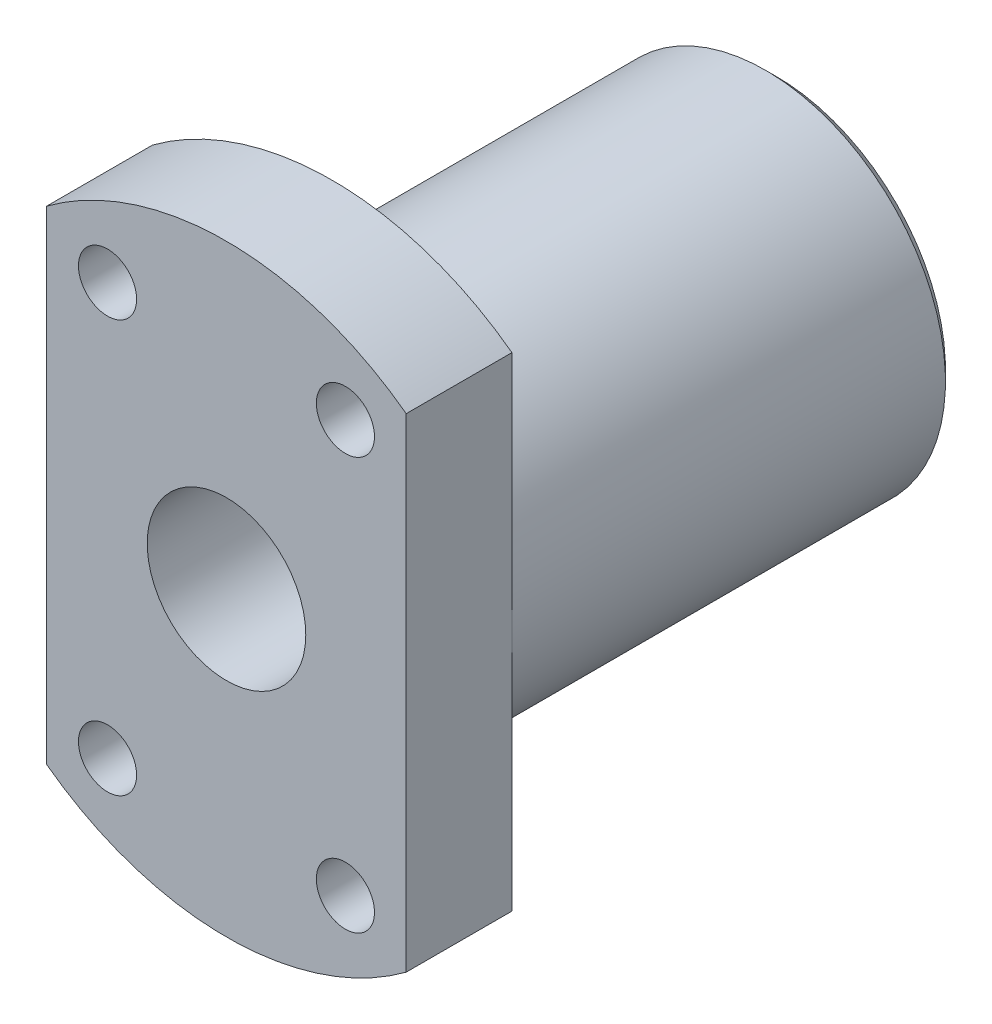
ISO-10303-21;
HEADER;
FILE_DESCRIPTION(('STEP AP214'),'2;1');
FILE_NAME('part.step','',(''),(''),'','','');
FILE_SCHEMA(('AUTOMOTIVE_DESIGN { 1 0 10303 214 1 1 1 1 }'));
ENDSEC;
DATA;
#1=APPLICATION_CONTEXT('core data for automotive mechanical design processes');
#2=APPLICATION_PROTOCOL_DEFINITION('international standard','automotive_design',2000,#1);
#3=PRODUCT_CONTEXT('',#1,'mechanical');
#4=PRODUCT('Part','Part','',(#3));
#5=PRODUCT_RELATED_PRODUCT_CATEGORY('part','',(#4));
#6=PRODUCT_DEFINITION_FORMATION('','',#4);
#7=PRODUCT_DEFINITION_CONTEXT('part definition',#1,'design');
#8=PRODUCT_DEFINITION('design','',#6,#7);
#9=PRODUCT_DEFINITION_SHAPE('','',#8);
#10=(LENGTH_UNIT() NAMED_UNIT(*) SI_UNIT(.MILLI.,.METRE.));
#11=(NAMED_UNIT(*) PLANE_ANGLE_UNIT() SI_UNIT($,.RADIAN.));
#12=(NAMED_UNIT(*) SI_UNIT($,.STERADIAN.) SOLID_ANGLE_UNIT());
#13=UNCERTAINTY_MEASURE_WITH_UNIT(LENGTH_MEASURE(1.E-05),#10,'distance_accuracy_value','');
#14=(GEOMETRIC_REPRESENTATION_CONTEXT(3) GLOBAL_UNCERTAINTY_ASSIGNED_CONTEXT((#13)) GLOBAL_UNIT_ASSIGNED_CONTEXT((#10,
#11,#12)) REPRESENTATION_CONTEXT('',''));
#15=CARTESIAN_POINT('',(0.,0.,0.));
#16=DIRECTION('',(0.,0.,1.));
#17=DIRECTION('',(1.,0.,0.));
#18=AXIS2_PLACEMENT_3D('',#15,#16,#17);
#19=CARTESIAN_POINT('',(0.,0.,0.));
#20=DIRECTION('',(0.,0.,1.));
#21=DIRECTION('',(1.,0.,0.));
#22=AXIS2_PLACEMENT_3D('',#19,#20,#21);
#23=PLANE('',#22);
#24=CARTESIAN_POINT('',(-11.25,19.4855715851499,0.));
#25=DIRECTION('',(0.,0.,-1.));
#26=DIRECTION('',(1.,0.,0.));
#27=AXIS2_PLACEMENT_3D('',#24,#25,#26);
#28=CIRCLE('',#27,2.75);
#29=CARTESIAN_POINT('',(-14.,19.4855715851499,0.));
#30=VERTEX_POINT('',#29);
#31=EDGE_CURVE('E132',#30,#30,#28,.T.);
#32=ORIENTED_EDGE('',*,*,#31,.F.);
#33=EDGE_LOOP('',(#32));
#34=FACE_BOUND('',#33,.T.);
#35=CARTESIAN_POINT('',(11.25,19.4855715851499,0.));
#36=DIRECTION('',(0.,0.,-1.));
#37=DIRECTION('',(-1.,0.,0.));
#38=AXIS2_PLACEMENT_3D('',#35,#36,#37);
#39=CIRCLE('',#38,2.75);
#40=CARTESIAN_POINT('',(8.50000000000003,19.4855715851499,0.));
#41=VERTEX_POINT('',#40);
#42=EDGE_CURVE('E108',#41,#41,#39,.T.);
#43=ORIENTED_EDGE('',*,*,#42,.F.);
#44=EDGE_LOOP('',(#43));
#45=FACE_BOUND('',#44,.T.);
#46=CARTESIAN_POINT('',(0.,0.,0.));
#47=DIRECTION('',(0.,0.,-1.));
#48=DIRECTION('',(-1.,0.,0.));
#49=AXIS2_PLACEMENT_3D('',#46,#47,#48);
#50=CIRCLE('',#49,17.);
#51=CARTESIAN_POINT('',(-17.,0.,0.));
#52=VERTEX_POINT('',#51);
#53=CARTESIAN_POINT('',(17.,0.,0.));
#54=VERTEX_POINT('',#53);
#55=EDGE_CURVE('E97',#52,#54,#50,.T.);
#56=ORIENTED_EDGE('',*,*,#55,.F.);
#57=DIRECTION('',(0.,1.,0.));
#58=VECTOR('',#57,1.);
#59=CARTESIAN_POINT('',(-17.,0.,0.));
#60=LINE('',#59,#58);
#61=CARTESIAN_POINT('',(-17.,22.8746584673957,0.));
#62=VERTEX_POINT('',#61);
#63=EDGE_CURVE('E83',#52,#62,#60,.T.);
#64=ORIENTED_EDGE('',*,*,#63,.T.);
#65=CARTESIAN_POINT('',(0.,0.,0.));
#66=DIRECTION('',(0.,0.,1.));
#67=DIRECTION('',(1.,0.,0.));
#68=AXIS2_PLACEMENT_3D('',#65,#66,#67);
#69=CIRCLE('',#68,28.5);
#70=CARTESIAN_POINT('',(17.,22.8746584673957,0.));
#71=VERTEX_POINT('',#70);
#72=EDGE_CURVE('E122',#71,#62,#69,.T.);
#73=ORIENTED_EDGE('',*,*,#72,.F.);
#74=DIRECTION('',(0.,-1.,0.));
#75=VECTOR('',#74,1.);
#76=CARTESIAN_POINT('',(17.,0.,0.));
#77=LINE('',#76,#75);
#78=EDGE_CURVE('E98',#71,#54,#77,.T.);
#79=ORIENTED_EDGE('',*,*,#78,.T.);
#80=EDGE_LOOP('',(#56,#64,#73,#79));
#81=FACE_BOUND('',#80,.T.);
#82=ADVANCED_FACE('F33',(#34,#45,#81),#23,.F.);
#83=CARTESIAN_POINT('',(11.25,-19.4855715851499,0.));
#84=DIRECTION('',(0.,0.,-1.));
#85=DIRECTION('',(1.,0.,0.));
#86=AXIS2_PLACEMENT_3D('',#83,#84,#85);
#87=CIRCLE('',#86,2.75);
#88=CARTESIAN_POINT('',(8.50000000000002,-19.4855715851499,0.));
#89=VERTEX_POINT('',#88);
#90=EDGE_CURVE('E139',#89,#89,#87,.T.);
#91=ORIENTED_EDGE('',*,*,#90,.F.);
#92=EDGE_LOOP('',(#91));
#93=FACE_BOUND('',#92,.T.);
#94=CARTESIAN_POINT('',(-11.25,-19.4855715851499,0.));
#95=DIRECTION('',(0.,0.,-1.));
#96=DIRECTION('',(-1.,0.,0.));
#97=AXIS2_PLACEMENT_3D('',#94,#95,#96);
#98=CIRCLE('',#97,2.75);
#99=CARTESIAN_POINT('',(-14.,-19.4855715851499,0.));
#100=VERTEX_POINT('',#99);
#101=EDGE_CURVE('E136',#100,#100,#98,.T.);
#102=ORIENTED_EDGE('',*,*,#101,.F.);
#103=EDGE_LOOP('',(#102));
#104=FACE_BOUND('',#103,.T.);
#105=EDGE_CURVE('E48',#54,#52,#50,.T.);
#106=ORIENTED_EDGE('',*,*,#105,.F.);
#107=CARTESIAN_POINT('',(17.,-22.8746584673958,0.));
#108=VERTEX_POINT('',#107);
#109=EDGE_CURVE('E52',#54,#108,#77,.T.);
#110=ORIENTED_EDGE('',*,*,#109,.T.);
#111=CARTESIAN_POINT('',(-17.,-22.8746584673958,0.));
#112=VERTEX_POINT('',#111);
#113=EDGE_CURVE('E80',#112,#108,#69,.T.);
#114=ORIENTED_EDGE('',*,*,#113,.F.);
#115=EDGE_CURVE('E76',#112,#52,#60,.T.);
#116=ORIENTED_EDGE('',*,*,#115,.T.);
#117=EDGE_LOOP('',(#106,#110,#114,#116));
#118=FACE_BOUND('',#117,.T.);
#119=ADVANCED_FACE('F78',(#93,#104,#118),#23,.F.);
#120=CARTESIAN_POINT('',(0.,0.,10.));
#121=DIRECTION('',(0.,0.,-1.));
#122=DIRECTION('',(-1.,0.,0.));
#123=AXIS2_PLACEMENT_3D('',#120,#121,#122);
#124=CYLINDRICAL_SURFACE('',#123,28.5);
#125=CARTESIAN_POINT('',(0.,0.,10.));
#126=DIRECTION('',(0.,0.,1.));
#127=DIRECTION('',(1.,0.,0.));
#128=AXIS2_PLACEMENT_3D('',#125,#126,#127);
#129=CIRCLE('',#128,28.5);
#130=CARTESIAN_POINT('',(17.,22.8746584673957,10.));
#131=VERTEX_POINT('',#130);
#132=CARTESIAN_POINT('',(-17.,22.8746584673957,10.));
#133=VERTEX_POINT('',#132);
#134=EDGE_CURVE('E125',#131,#133,#129,.T.);
#135=ORIENTED_EDGE('',*,*,#134,.F.);
#136=DIRECTION('',(0.,0.,-1.));
#137=VECTOR('',#136,1.);
#138=CARTESIAN_POINT('',(17.,22.8746584673957,10.));
#139=LINE('',#138,#137);
#140=EDGE_CURVE('E114',#131,#71,#139,.T.);
#141=ORIENTED_EDGE('',*,*,#140,.T.);
#142=ORIENTED_EDGE('',*,*,#72,.T.);
#143=DIRECTION('',(0.,0.,-1.));
#144=VECTOR('',#143,1.);
#145=CARTESIAN_POINT('',(-17.,22.8746584673957,10.));
#146=LINE('',#145,#144);
#147=EDGE_CURVE('E90',#62,#133,#146,.F.);
#148=ORIENTED_EDGE('',*,*,#147,.T.);
#149=EDGE_LOOP('',(#135,#141,#142,#148));
#150=FACE_BOUND('',#149,.T.);
#151=ADVANCED_FACE('F194',(#150),#124,.T.);
#152=ORIENTED_EDGE('',*,*,#113,.T.);
#153=DIRECTION('',(0.,0.,-1.));
#154=VECTOR('',#153,1.);
#155=CARTESIAN_POINT('',(17.,-22.8746584673958,10.));
#156=LINE('',#155,#154);
#157=CARTESIAN_POINT('',(17.,-22.8746584673958,10.));
#158=VERTEX_POINT('',#157);
#159=EDGE_CURVE('E111',#108,#158,#156,.F.);
#160=ORIENTED_EDGE('',*,*,#159,.T.);
#161=CARTESIAN_POINT('',(-17.,-22.8746584673958,10.));
#162=VERTEX_POINT('',#161);
#163=EDGE_CURVE('E94',#162,#158,#129,.T.);
#164=ORIENTED_EDGE('',*,*,#163,.F.);
#165=DIRECTION('',(0.,0.,-1.));
#166=VECTOR('',#165,1.);
#167=CARTESIAN_POINT('',(-17.,-22.8746584673958,10.));
#168=LINE('',#167,#166);
#169=EDGE_CURVE('E120',#162,#112,#168,.T.);
#170=ORIENTED_EDGE('',*,*,#169,.T.);
#171=EDGE_LOOP('',(#152,#160,#164,#170));
#172=FACE_BOUND('',#171,.T.);
#173=ADVANCED_FACE('F191',(#172),#124,.T.);
#174=CARTESIAN_POINT('',(0.,0.,10.));
#175=DIRECTION('',(0.,0.,1.));
#176=DIRECTION('',(1.,0.,0.));
#177=AXIS2_PLACEMENT_3D('',#174,#175,#176);
#178=PLANE('',#177);
#179=CARTESIAN_POINT('',(0.,0.,10.));
#180=DIRECTION('',(0.,0.,1.));
#181=DIRECTION('',(1.,0.,0.));
#182=AXIS2_PLACEMENT_3D('',#179,#180,#181);
#183=CIRCLE('',#182,7.5);
#184=CARTESIAN_POINT('',(7.5,0.,10.));
#185=VERTEX_POINT('',#184);
#186=EDGE_CURVE('E150',#185,#185,#183,.T.);
#187=ORIENTED_EDGE('',*,*,#186,.F.);
#188=EDGE_LOOP('',(#187));
#189=FACE_BOUND('',#188,.T.);
#190=CARTESIAN_POINT('',(11.25,-19.4855715851499,10.));
#191=DIRECTION('',(0.,0.,1.));
#192=DIRECTION('',(1.,0.,0.));
#193=AXIS2_PLACEMENT_3D('',#190,#191,#192);
#194=CIRCLE('',#193,2.75);
#195=CARTESIAN_POINT('',(8.50000000000002,-19.4855715851499,9.99999999999999));
#196=VERTEX_POINT('',#195);
#197=EDGE_CURVE('E137',#196,#196,#194,.T.);
#198=ORIENTED_EDGE('',*,*,#197,.F.);
#199=EDGE_LOOP('',(#198));
#200=FACE_BOUND('',#199,.T.);
#201=CARTESIAN_POINT('',(-11.25,-19.4855715851499,10.));
#202=DIRECTION('',(0.,0.,1.));
#203=DIRECTION('',(1.,0.,0.));
#204=AXIS2_PLACEMENT_3D('',#201,#202,#203);
#205=CIRCLE('',#204,2.75);
#206=CARTESIAN_POINT('',(-14.,-19.4855715851499,9.99999999999999));
#207=VERTEX_POINT('',#206);
#208=EDGE_CURVE('E133',#207,#207,#205,.T.);
#209=ORIENTED_EDGE('',*,*,#208,.F.);
#210=EDGE_LOOP('',(#209));
#211=FACE_BOUND('',#210,.T.);
#212=CARTESIAN_POINT('',(-11.25,19.4855715851499,10.));
#213=DIRECTION('',(0.,0.,1.));
#214=DIRECTION('',(1.,0.,0.));
#215=AXIS2_PLACEMENT_3D('',#212,#213,#214);
#216=CIRCLE('',#215,2.75);
#217=CARTESIAN_POINT('',(-14.,19.4855715851499,9.99999999999999));
#218=VERTEX_POINT('',#217);
#219=EDGE_CURVE('E129',#218,#218,#216,.T.);
#220=ORIENTED_EDGE('',*,*,#219,.F.);
#221=EDGE_LOOP('',(#220));
#222=FACE_BOUND('',#221,.T.);
#223=CARTESIAN_POINT('',(11.25,19.4855715851499,10.));
#224=DIRECTION('',(0.,0.,1.));
#225=DIRECTION('',(1.,0.,0.));
#226=AXIS2_PLACEMENT_3D('',#223,#224,#225);
#227=CIRCLE('',#226,2.75);
#228=CARTESIAN_POINT('',(8.50000000000003,19.4855715851499,9.99999999999999));
#229=VERTEX_POINT('',#228);
#230=EDGE_CURVE('E101',#229,#229,#227,.T.);
#231=ORIENTED_EDGE('',*,*,#230,.F.);
#232=EDGE_LOOP('',(#231));
#233=FACE_BOUND('',#232,.T.);
#234=DIRECTION('',(0.,-1.,0.));
#235=VECTOR('',#234,1.);
#236=CARTESIAN_POINT('',(17.,37.2733529755393,10.));
#237=LINE('',#236,#235);
#238=EDGE_CURVE('E100',#131,#158,#237,.T.);
#239=ORIENTED_EDGE('',*,*,#238,.F.);
#240=ORIENTED_EDGE('',*,*,#134,.T.);
#241=DIRECTION('',(0.,1.,0.));
#242=VECTOR('',#241,1.);
#243=CARTESIAN_POINT('',(-17.,37.2733529755393,10.));
#244=LINE('',#243,#242);
#245=EDGE_CURVE('E117',#162,#133,#244,.T.);
#246=ORIENTED_EDGE('',*,*,#245,.F.);
#247=ORIENTED_EDGE('',*,*,#163,.T.);
#248=EDGE_LOOP('',(#239,#240,#246,#247));
#249=FACE_BOUND('',#248,.T.);
#250=ADVANCED_FACE('F189',(#189,#200,#211,#222,#233,#249),#178,.T.);
#251=CARTESIAN_POINT('',(-17.,37.2733529755393,0.));
#252=DIRECTION('',(1.,0.,0.));
#253=DIRECTION('',(0.,1.,0.));
#254=AXIS2_PLACEMENT_3D('',#251,#252,#253);
#255=PLANE('',#254);
#256=ORIENTED_EDGE('',*,*,#245,.T.);
#257=ORIENTED_EDGE('',*,*,#147,.F.);
#258=ORIENTED_EDGE('',*,*,#63,.F.);
#259=ORIENTED_EDGE('',*,*,#115,.F.);
#260=ORIENTED_EDGE('',*,*,#169,.F.);
#261=EDGE_LOOP('',(#256,#257,#258,#259,#260));
#262=FACE_BOUND('',#261,.T.);
#263=ADVANCED_FACE('F88',(#262),#255,.F.);
#264=CARTESIAN_POINT('',(17.,37.2733529755393,0.));
#265=DIRECTION('',(-1.,0.,0.));
#266=DIRECTION('',(0.,-1.,0.));
#267=AXIS2_PLACEMENT_3D('',#264,#265,#266);
#268=PLANE('',#267);
#269=ORIENTED_EDGE('',*,*,#238,.T.);
#270=ORIENTED_EDGE('',*,*,#159,.F.);
#271=ORIENTED_EDGE('',*,*,#109,.F.);
#272=ORIENTED_EDGE('',*,*,#78,.F.);
#273=ORIENTED_EDGE('',*,*,#140,.F.);
#274=EDGE_LOOP('',(#269,#270,#271,#272,#273));
#275=FACE_BOUND('',#274,.T.);
#276=ADVANCED_FACE('F182',(#275),#268,.F.);
#277=CARTESIAN_POINT('',(0.,0.,-42.));
#278=DIRECTION('',(0.,0.,1.));
#279=DIRECTION('',(1.,0.,0.));
#280=AXIS2_PLACEMENT_3D('',#277,#278,#279);
#281=CYLINDRICAL_SURFACE('',#280,17.);
#282=CARTESIAN_POINT('',(0.,0.,-41.));
#283=DIRECTION('',(0.,0.,-1.));
#284=DIRECTION('',(-1.,0.,0.));
#285=AXIS2_PLACEMENT_3D('',#282,#283,#284);
#286=CIRCLE('',#285,17.);
#287=CARTESIAN_POINT('',(-17.,0.,-41.));
#288=VERTEX_POINT('',#287);
#289=EDGE_CURVE('E11',#288,#288,#286,.F.);
#290=ORIENTED_EDGE('',*,*,#289,.T.);
#291=EDGE_LOOP('',(#290));
#292=FACE_BOUND('',#291,.T.);
#293=ORIENTED_EDGE('',*,*,#55,.T.);
#294=ORIENTED_EDGE('',*,*,#105,.T.);
#295=EDGE_LOOP('',(#293,#294));
#296=FACE_BOUND('',#295,.T.);
#297=ADVANCED_FACE('F103',(#292,#296),#281,.T.);
#298=CARTESIAN_POINT('',(0.,0.,-42.));
#299=DIRECTION('',(0.,0.,-1.));
#300=DIRECTION('',(-1.,0.,0.));
#301=AXIS2_PLACEMENT_3D('',#298,#299,#300);
#302=PLANE('',#301);
#303=CARTESIAN_POINT('',(0.,0.,-42.));
#304=DIRECTION('',(0.,0.,-1.));
#305=DIRECTION('',(-1.,0.,0.));
#306=AXIS2_PLACEMENT_3D('',#303,#304,#305);
#307=CIRCLE('',#306,16.);
#308=CARTESIAN_POINT('',(-16.,0.,-42.));
#309=VERTEX_POINT('',#308);
#310=EDGE_CURVE('E41',#309,#309,#307,.T.);
#311=ORIENTED_EDGE('',*,*,#310,.T.);
#312=EDGE_LOOP('',(#311));
#313=FACE_BOUND('',#312,.T.);
#314=CARTESIAN_POINT('',(0.,0.,-42.));
#315=DIRECTION('',(0.,0.,1.));
#316=DIRECTION('',(1.,0.,0.));
#317=AXIS2_PLACEMENT_3D('',#314,#315,#316);
#318=CIRCLE('',#317,7.5);
#319=CARTESIAN_POINT('',(7.5,0.,-42.));
#320=VERTEX_POINT('',#319);
#321=EDGE_CURVE('E145',#320,#320,#318,.T.);
#322=ORIENTED_EDGE('',*,*,#321,.T.);
#323=EDGE_LOOP('',(#322));
#324=FACE_BOUND('',#323,.T.);
#325=ADVANCED_FACE('F166',(#313,#324),#302,.T.);
#326=CARTESIAN_POINT('',(11.25,19.4855715851499,42.));
#327=DIRECTION('',(0.,0.,-1.));
#328=DIRECTION('',(-1.,0.,0.));
#329=AXIS2_PLACEMENT_3D('',#326,#327,#328);
#330=CYLINDRICAL_SURFACE('',#329,2.75);
#331=CARTESIAN_POINT('',(8.50000000000003,19.4855715851499,9.99999999999999));
#332=CARTESIAN_POINT('',(8.50000000000003,19.4855715851499,9.89583333333333));
#333=CARTESIAN_POINT('',(8.50000000000003,19.4855715851499,9.79166666666666));
#334=CARTESIAN_POINT('',(8.50000000000003,19.4855715851499,9.58333333333333));
#335=CARTESIAN_POINT('',(8.50000000000003,19.4855715851499,9.47916666666666));
#336=CARTESIAN_POINT('',(8.50000000000003,19.4855715851499,9.27083333333333));
#337=CARTESIAN_POINT('',(8.50000000000003,19.4855715851499,9.16666666666666));
#338=CARTESIAN_POINT('',(8.50000000000003,19.4855715851499,8.95833333333333));
#339=CARTESIAN_POINT('',(8.50000000000003,19.4855715851499,8.85416666666666));
#340=CARTESIAN_POINT('',(8.50000000000003,19.4855715851499,8.64583333333333));
#341=CARTESIAN_POINT('',(8.50000000000003,19.4855715851499,8.54166666666666));
#342=CARTESIAN_POINT('',(8.50000000000003,19.4855715851499,8.33333333333333));
#343=CARTESIAN_POINT('',(8.50000000000003,19.4855715851499,8.22916666666666));
#344=CARTESIAN_POINT('',(8.50000000000003,19.4855715851499,8.02083333333333));
#345=CARTESIAN_POINT('',(8.50000000000003,19.4855715851499,7.91666666666666));
#346=CARTESIAN_POINT('',(8.50000000000003,19.4855715851499,7.70833333333333));
#347=CARTESIAN_POINT('',(8.50000000000003,19.4855715851499,7.60416666666666));
#348=CARTESIAN_POINT('',(8.50000000000003,19.4855715851499,7.39583333333333));
#349=CARTESIAN_POINT('',(8.50000000000003,19.4855715851499,7.29166666666666));
#350=CARTESIAN_POINT('',(8.50000000000003,19.4855715851499,7.08333333333333));
#351=CARTESIAN_POINT('',(8.50000000000003,19.4855715851499,6.97916666666667));
#352=CARTESIAN_POINT('',(8.50000000000003,19.4855715851499,6.77083333333333));
#353=CARTESIAN_POINT('',(8.50000000000003,19.4855715851499,6.66666666666667));
#354=CARTESIAN_POINT('',(8.50000000000003,19.4855715851499,6.45833333333333));
#355=CARTESIAN_POINT('',(8.50000000000003,19.4855715851499,6.35416666666667));
#356=CARTESIAN_POINT('',(8.50000000000003,19.4855715851499,6.14583333333333));
#357=CARTESIAN_POINT('',(8.50000000000003,19.4855715851499,6.04166666666667));
#358=CARTESIAN_POINT('',(8.50000000000003,19.4855715851499,5.83333333333333));
#359=CARTESIAN_POINT('',(8.50000000000003,19.4855715851499,5.72916666666666));
#360=CARTESIAN_POINT('',(8.50000000000003,19.4855715851499,5.52083333333333));
#361=CARTESIAN_POINT('',(8.50000000000003,19.4855715851499,5.41666666666666));
#362=CARTESIAN_POINT('',(8.50000000000003,19.4855715851499,5.20833333333333));
#363=CARTESIAN_POINT('',(8.50000000000003,19.4855715851499,5.10416666666666));
#364=CARTESIAN_POINT('',(8.50000000000003,19.4855715851499,4.89583333333333));
#365=CARTESIAN_POINT('',(8.50000000000003,19.4855715851499,4.79166666666666));
#366=CARTESIAN_POINT('',(8.50000000000003,19.4855715851499,4.58333333333333));
#367=CARTESIAN_POINT('',(8.50000000000003,19.4855715851499,4.47916666666666));
#368=CARTESIAN_POINT('',(8.50000000000003,19.4855715851499,4.27083333333333));
#369=CARTESIAN_POINT('',(8.50000000000003,19.4855715851499,4.16666666666666));
#370=CARTESIAN_POINT('',(8.50000000000003,19.4855715851499,3.95833333333333));
#371=CARTESIAN_POINT('',(8.50000000000003,19.4855715851499,3.85416666666666));
#372=CARTESIAN_POINT('',(8.50000000000003,19.4855715851499,3.64583333333333));
#373=CARTESIAN_POINT('',(8.50000000000003,19.4855715851499,3.54166666666666));
#374=CARTESIAN_POINT('',(8.50000000000003,19.4855715851499,3.33333333333333));
#375=CARTESIAN_POINT('',(8.50000000000003,19.4855715851499,3.22916666666666));
#376=CARTESIAN_POINT('',(8.50000000000003,19.4855715851499,3.02083333333333));
#377=CARTESIAN_POINT('',(8.50000000000003,19.4855715851499,2.91666666666666));
#378=CARTESIAN_POINT('',(8.50000000000003,19.4855715851499,2.70833333333333));
#379=CARTESIAN_POINT('',(8.50000000000003,19.4855715851499,2.60416666666667));
#380=CARTESIAN_POINT('',(8.50000000000003,19.4855715851499,2.39583333333333));
#381=CARTESIAN_POINT('',(8.50000000000003,19.4855715851499,2.29166666666666));
#382=CARTESIAN_POINT('',(8.50000000000003,19.4855715851499,2.08333333333333));
#383=CARTESIAN_POINT('',(8.50000000000003,19.4855715851499,1.97916666666667));
#384=CARTESIAN_POINT('',(8.50000000000003,19.4855715851499,1.77083333333334));
#385=CARTESIAN_POINT('',(8.50000000000003,19.4855715851499,1.66666666666667));
#386=CARTESIAN_POINT('',(8.50000000000003,19.4855715851499,1.45833333333333));
#387=CARTESIAN_POINT('',(8.50000000000003,19.4855715851499,1.35416666666667));
#388=CARTESIAN_POINT('',(8.50000000000003,19.4855715851499,1.14583333333333));
#389=CARTESIAN_POINT('',(8.50000000000003,19.4855715851499,1.04166666666667));
#390=CARTESIAN_POINT('',(8.50000000000003,19.4855715851499,0.833333333333334));
#391=CARTESIAN_POINT('',(8.50000000000003,19.4855715851499,0.729166666666667));
#392=CARTESIAN_POINT('',(8.50000000000003,19.4855715851499,0.520833333333334));
#393=CARTESIAN_POINT('',(8.50000000000003,19.4855715851499,0.416666666666667));
#394=CARTESIAN_POINT('',(8.50000000000003,19.4855715851499,0.208333333333334));
#395=CARTESIAN_POINT('',(8.50000000000003,19.4855715851499,0.104166666666667));
#396=CARTESIAN_POINT('',(8.50000000000003,19.4855715851499,0.));
#397=B_SPLINE_CURVE_WITH_KNOTS('',3,(#331,#332,#333,#334,#335,#336,#337,#338,#339,#340,#341,
#342,#343,#344,#345,#346,#347,#348,#349,#350,#351,#352,#353,#354,#355,#356,#357,#358,#359,#360,
#361,#362,#363,#364,#365,#366,#367,#368,#369,#370,#371,#372,#373,#374,#375,#376,#377,#378,#379,
#380,#381,#382,#383,#384,#385,#386,#387,#388,#389,#390,#391,#392,#393,#394,#395,#396),
.UNSPECIFIED.,.F.,.F.,(4,2,2,2,2,2,2,2,2,2,2,2,2,2,2,2,2,2,2,2,2,2,2,2,2,2,2,2,2,2,2,2,4),(0.,
0.3125,0.625000000000001,0.937500000000001,1.25,1.5625,1.875,2.1875,2.5,2.8125,3.125,3.4375,
3.75,4.0625,4.375,4.6875,5.,5.3125,5.625,5.9375,6.25,6.5625,6.875,7.1875,7.49999999999999,
7.8125,8.12499999999999,8.43749999999999,8.74999999999999,9.06249999999999,9.37499999999999,
9.68749999999999,9.99999999999999),.UNSPECIFIED.);
#398=EDGE_CURVE('BSEAM164',#229,#41,#397,.T.);
#399=ORIENTED_EDGE('',*,*,#230,.T.);
#400=ORIENTED_EDGE('',*,*,#42,.T.);
#401=ORIENTED_EDGE('',*,*,#398,.T.);
#402=ORIENTED_EDGE('',*,*,#398,.F.);
#403=EDGE_LOOP('',(#399,#401,#400,#402));
#404=FACE_BOUND('',#403,.T.);
#405=ADVANCED_FACE('F164',(#404),#330,.F.);
#406=CARTESIAN_POINT('',(-11.25,19.4855715851499,42.));
#407=DIRECTION('',(0.,0.,-1.));
#408=DIRECTION('',(-1.,0.,0.));
#409=AXIS2_PLACEMENT_3D('',#406,#407,#408);
#410=CYLINDRICAL_SURFACE('',#409,2.75);
#411=CARTESIAN_POINT('',(-14.,19.4855715851499,9.99999999999999));
#412=CARTESIAN_POINT('',(-14.,19.4855715851499,9.89583333333333));
#413=CARTESIAN_POINT('',(-14.,19.4855715851499,9.79166666666666));
#414=CARTESIAN_POINT('',(-14.,19.4855715851499,9.58333333333333));
#415=CARTESIAN_POINT('',(-14.,19.4855715851499,9.47916666666666));
#416=CARTESIAN_POINT('',(-14.,19.4855715851499,9.27083333333333));
#417=CARTESIAN_POINT('',(-14.,19.4855715851499,9.16666666666666));
#418=CARTESIAN_POINT('',(-14.,19.4855715851499,8.95833333333333));
#419=CARTESIAN_POINT('',(-14.,19.4855715851499,8.85416666666666));
#420=CARTESIAN_POINT('',(-14.,19.4855715851499,8.64583333333333));
#421=CARTESIAN_POINT('',(-14.,19.4855715851499,8.54166666666666));
#422=CARTESIAN_POINT('',(-14.,19.4855715851499,8.33333333333333));
#423=CARTESIAN_POINT('',(-14.,19.4855715851499,8.22916666666666));
#424=CARTESIAN_POINT('',(-14.,19.4855715851499,8.02083333333333));
#425=CARTESIAN_POINT('',(-14.,19.4855715851499,7.91666666666666));
#426=CARTESIAN_POINT('',(-14.,19.4855715851499,7.70833333333333));
#427=CARTESIAN_POINT('',(-14.,19.4855715851499,7.60416666666666));
#428=CARTESIAN_POINT('',(-14.,19.4855715851499,7.39583333333333));
#429=CARTESIAN_POINT('',(-14.,19.4855715851499,7.29166666666666));
#430=CARTESIAN_POINT('',(-14.,19.4855715851499,7.08333333333333));
#431=CARTESIAN_POINT('',(-14.,19.4855715851499,6.97916666666667));
#432=CARTESIAN_POINT('',(-14.,19.4855715851499,6.77083333333333));
#433=CARTESIAN_POINT('',(-14.,19.4855715851499,6.66666666666667));
#434=CARTESIAN_POINT('',(-14.,19.4855715851499,6.45833333333333));
#435=CARTESIAN_POINT('',(-14.,19.4855715851499,6.35416666666667));
#436=CARTESIAN_POINT('',(-14.,19.4855715851499,6.14583333333333));
#437=CARTESIAN_POINT('',(-14.,19.4855715851499,6.04166666666667));
#438=CARTESIAN_POINT('',(-14.,19.4855715851499,5.83333333333333));
#439=CARTESIAN_POINT('',(-14.,19.4855715851499,5.72916666666666));
#440=CARTESIAN_POINT('',(-14.,19.4855715851499,5.52083333333333));
#441=CARTESIAN_POINT('',(-14.,19.4855715851499,5.41666666666666));
#442=CARTESIAN_POINT('',(-14.,19.4855715851499,5.20833333333333));
#443=CARTESIAN_POINT('',(-14.,19.4855715851499,5.10416666666666));
#444=CARTESIAN_POINT('',(-14.,19.4855715851499,4.89583333333333));
#445=CARTESIAN_POINT('',(-14.,19.4855715851499,4.79166666666666));
#446=CARTESIAN_POINT('',(-14.,19.4855715851499,4.58333333333333));
#447=CARTESIAN_POINT('',(-14.,19.4855715851499,4.47916666666666));
#448=CARTESIAN_POINT('',(-14.,19.4855715851499,4.27083333333333));
#449=CARTESIAN_POINT('',(-14.,19.4855715851499,4.16666666666666));
#450=CARTESIAN_POINT('',(-14.,19.4855715851499,3.95833333333333));
#451=CARTESIAN_POINT('',(-14.,19.4855715851499,3.85416666666666));
#452=CARTESIAN_POINT('',(-14.,19.4855715851499,3.64583333333333));
#453=CARTESIAN_POINT('',(-14.,19.4855715851499,3.54166666666666));
#454=CARTESIAN_POINT('',(-14.,19.4855715851499,3.33333333333333));
#455=CARTESIAN_POINT('',(-14.,19.4855715851499,3.22916666666666));
#456=CARTESIAN_POINT('',(-14.,19.4855715851499,3.02083333333333));
#457=CARTESIAN_POINT('',(-14.,19.4855715851499,2.91666666666666));
#458=CARTESIAN_POINT('',(-14.,19.4855715851499,2.70833333333333));
#459=CARTESIAN_POINT('',(-14.,19.4855715851499,2.60416666666667));
#460=CARTESIAN_POINT('',(-14.,19.4855715851499,2.39583333333333));
#461=CARTESIAN_POINT('',(-14.,19.4855715851499,2.29166666666666));
#462=CARTESIAN_POINT('',(-14.,19.4855715851499,2.08333333333333));
#463=CARTESIAN_POINT('',(-14.,19.4855715851499,1.97916666666667));
#464=CARTESIAN_POINT('',(-14.,19.4855715851499,1.77083333333334));
#465=CARTESIAN_POINT('',(-14.,19.4855715851499,1.66666666666667));
#466=CARTESIAN_POINT('',(-14.,19.4855715851499,1.45833333333333));
#467=CARTESIAN_POINT('',(-14.,19.4855715851499,1.35416666666667));
#468=CARTESIAN_POINT('',(-14.,19.4855715851499,1.14583333333333));
#469=CARTESIAN_POINT('',(-14.,19.4855715851499,1.04166666666667));
#470=CARTESIAN_POINT('',(-14.,19.4855715851499,0.833333333333334));
#471=CARTESIAN_POINT('',(-14.,19.4855715851499,0.729166666666667));
#472=CARTESIAN_POINT('',(-14.,19.4855715851499,0.520833333333334));
#473=CARTESIAN_POINT('',(-14.,19.4855715851499,0.416666666666667));
#474=CARTESIAN_POINT('',(-14.,19.4855715851499,0.208333333333334));
#475=CARTESIAN_POINT('',(-14.,19.4855715851499,0.104166666666667));
#476=CARTESIAN_POINT('',(-14.,19.4855715851499,0.));
#477=B_SPLINE_CURVE_WITH_KNOTS('',3,(#411,#412,#413,#414,#415,#416,#417,#418,#419,#420,#421,
#422,#423,#424,#425,#426,#427,#428,#429,#430,#431,#432,#433,#434,#435,#436,#437,#438,#439,#440,
#441,#442,#443,#444,#445,#446,#447,#448,#449,#450,#451,#452,#453,#454,#455,#456,#457,#458,#459,
#460,#461,#462,#463,#464,#465,#466,#467,#468,#469,#470,#471,#472,#473,#474,#475,#476),
.UNSPECIFIED.,.F.,.F.,(4,2,2,2,2,2,2,2,2,2,2,2,2,2,2,2,2,2,2,2,2,2,2,2,2,2,2,2,2,2,2,2,4),(0.,
0.3125,0.625000000000001,0.937500000000001,1.25,1.5625,1.875,2.1875,2.5,2.8125,3.125,3.4375,
3.75,4.0625,4.375,4.6875,5.,5.3125,5.625,5.9375,6.25,6.5625,6.875,7.1875,7.49999999999999,
7.8125,8.12499999999999,8.43749999999999,8.74999999999999,9.06249999999999,9.37499999999999,
9.68749999999999,9.99999999999999),.UNSPECIFIED.);
#478=EDGE_CURVE('BSEAM156',#218,#30,#477,.T.);
#479=ORIENTED_EDGE('',*,*,#219,.T.);
#480=ORIENTED_EDGE('',*,*,#31,.T.);
#481=ORIENTED_EDGE('',*,*,#478,.T.);
#482=ORIENTED_EDGE('',*,*,#478,.F.);
#483=EDGE_LOOP('',(#479,#481,#480,#482));
#484=FACE_BOUND('',#483,.T.);
#485=ADVANCED_FACE('F156',(#484),#410,.F.);
#486=CARTESIAN_POINT('',(-11.25,-19.4855715851499,42.));
#487=DIRECTION('',(0.,0.,-1.));
#488=DIRECTION('',(-1.,0.,0.));
#489=AXIS2_PLACEMENT_3D('',#486,#487,#488);
#490=CYLINDRICAL_SURFACE('',#489,2.75);
#491=CARTESIAN_POINT('',(-14.,-19.4855715851499,9.99999999999999));
#492=CARTESIAN_POINT('',(-14.,-19.4855715851499,9.89583333333333));
#493=CARTESIAN_POINT('',(-14.,-19.4855715851499,9.79166666666666));
#494=CARTESIAN_POINT('',(-14.,-19.4855715851499,9.58333333333333));
#495=CARTESIAN_POINT('',(-14.,-19.4855715851499,9.47916666666666));
#496=CARTESIAN_POINT('',(-14.,-19.4855715851499,9.27083333333333));
#497=CARTESIAN_POINT('',(-14.,-19.4855715851499,9.16666666666666));
#498=CARTESIAN_POINT('',(-14.,-19.4855715851499,8.95833333333333));
#499=CARTESIAN_POINT('',(-14.,-19.4855715851499,8.85416666666666));
#500=CARTESIAN_POINT('',(-14.,-19.4855715851499,8.64583333333333));
#501=CARTESIAN_POINT('',(-14.,-19.4855715851499,8.54166666666666));
#502=CARTESIAN_POINT('',(-14.,-19.4855715851499,8.33333333333333));
#503=CARTESIAN_POINT('',(-14.,-19.4855715851499,8.22916666666666));
#504=CARTESIAN_POINT('',(-14.,-19.4855715851499,8.02083333333333));
#505=CARTESIAN_POINT('',(-14.,-19.4855715851499,7.91666666666666));
#506=CARTESIAN_POINT('',(-14.,-19.4855715851499,7.70833333333333));
#507=CARTESIAN_POINT('',(-14.,-19.4855715851499,7.60416666666666));
#508=CARTESIAN_POINT('',(-14.,-19.4855715851499,7.39583333333333));
#509=CARTESIAN_POINT('',(-14.,-19.4855715851499,7.29166666666666));
#510=CARTESIAN_POINT('',(-14.,-19.4855715851499,7.08333333333333));
#511=CARTESIAN_POINT('',(-14.,-19.4855715851499,6.97916666666667));
#512=CARTESIAN_POINT('',(-14.,-19.4855715851499,6.77083333333333));
#513=CARTESIAN_POINT('',(-14.,-19.4855715851499,6.66666666666667));
#514=CARTESIAN_POINT('',(-14.,-19.4855715851499,6.45833333333333));
#515=CARTESIAN_POINT('',(-14.,-19.4855715851499,6.35416666666667));
#516=CARTESIAN_POINT('',(-14.,-19.4855715851499,6.14583333333333));
#517=CARTESIAN_POINT('',(-14.,-19.4855715851499,6.04166666666667));
#518=CARTESIAN_POINT('',(-14.,-19.4855715851499,5.83333333333333));
#519=CARTESIAN_POINT('',(-14.,-19.4855715851499,5.72916666666666));
#520=CARTESIAN_POINT('',(-14.,-19.4855715851499,5.52083333333333));
#521=CARTESIAN_POINT('',(-14.,-19.4855715851499,5.41666666666666));
#522=CARTESIAN_POINT('',(-14.,-19.4855715851499,5.20833333333333));
#523=CARTESIAN_POINT('',(-14.,-19.4855715851499,5.10416666666666));
#524=CARTESIAN_POINT('',(-14.,-19.4855715851499,4.89583333333333));
#525=CARTESIAN_POINT('',(-14.,-19.4855715851499,4.79166666666666));
#526=CARTESIAN_POINT('',(-14.,-19.4855715851499,4.58333333333333));
#527=CARTESIAN_POINT('',(-14.,-19.4855715851499,4.47916666666666));
#528=CARTESIAN_POINT('',(-14.,-19.4855715851499,4.27083333333333));
#529=CARTESIAN_POINT('',(-14.,-19.4855715851499,4.16666666666666));
#530=CARTESIAN_POINT('',(-14.,-19.4855715851499,3.95833333333333));
#531=CARTESIAN_POINT('',(-14.,-19.4855715851499,3.85416666666666));
#532=CARTESIAN_POINT('',(-14.,-19.4855715851499,3.64583333333333));
#533=CARTESIAN_POINT('',(-14.,-19.4855715851499,3.54166666666666));
#534=CARTESIAN_POINT('',(-14.,-19.4855715851499,3.33333333333333));
#535=CARTESIAN_POINT('',(-14.,-19.4855715851499,3.22916666666666));
#536=CARTESIAN_POINT('',(-14.,-19.4855715851499,3.02083333333333));
#537=CARTESIAN_POINT('',(-14.,-19.4855715851499,2.91666666666666));
#538=CARTESIAN_POINT('',(-14.,-19.4855715851499,2.70833333333333));
#539=CARTESIAN_POINT('',(-14.,-19.4855715851499,2.60416666666667));
#540=CARTESIAN_POINT('',(-14.,-19.4855715851499,2.39583333333333));
#541=CARTESIAN_POINT('',(-14.,-19.4855715851499,2.29166666666666));
#542=CARTESIAN_POINT('',(-14.,-19.4855715851499,2.08333333333333));
#543=CARTESIAN_POINT('',(-14.,-19.4855715851499,1.97916666666667));
#544=CARTESIAN_POINT('',(-14.,-19.4855715851499,1.77083333333334));
#545=CARTESIAN_POINT('',(-14.,-19.4855715851499,1.66666666666667));
#546=CARTESIAN_POINT('',(-14.,-19.4855715851499,1.45833333333333));
#547=CARTESIAN_POINT('',(-14.,-19.4855715851499,1.35416666666667));
#548=CARTESIAN_POINT('',(-14.,-19.4855715851499,1.14583333333333));
#549=CARTESIAN_POINT('',(-14.,-19.4855715851499,1.04166666666667));
#550=CARTESIAN_POINT('',(-14.,-19.4855715851499,0.833333333333334));
#551=CARTESIAN_POINT('',(-14.,-19.4855715851499,0.729166666666667));
#552=CARTESIAN_POINT('',(-14.,-19.4855715851499,0.520833333333334));
#553=CARTESIAN_POINT('',(-14.,-19.4855715851499,0.416666666666667));
#554=CARTESIAN_POINT('',(-14.,-19.4855715851499,0.208333333333334));
#555=CARTESIAN_POINT('',(-14.,-19.4855715851499,0.104166666666667));
#556=CARTESIAN_POINT('',(-14.,-19.4855715851499,0.));
#557=B_SPLINE_CURVE_WITH_KNOTS('',3,(#491,#492,#493,#494,#495,#496,#497,#498,#499,#500,#501,
#502,#503,#504,#505,#506,#507,#508,#509,#510,#511,#512,#513,#514,#515,#516,#517,#518,#519,#520,
#521,#522,#523,#524,#525,#526,#527,#528,#529,#530,#531,#532,#533,#534,#535,#536,#537,#538,#539,
#540,#541,#542,#543,#544,#545,#546,#547,#548,#549,#550,#551,#552,#553,#554,#555,#556),
.UNSPECIFIED.,.F.,.F.,(4,2,2,2,2,2,2,2,2,2,2,2,2,2,2,2,2,2,2,2,2,2,2,2,2,2,2,2,2,2,2,2,4),(0.,
0.3125,0.625000000000001,0.937500000000001,1.25,1.5625,1.875,2.1875,2.5,2.8125,3.125,3.4375,
3.75,4.0625,4.375,4.6875,5.,5.3125,5.625,5.9375,6.25,6.5625,6.875,7.1875,7.49999999999999,
7.8125,8.12499999999999,8.43749999999999,8.74999999999999,9.06249999999999,9.37499999999999,
9.68749999999999,9.99999999999999),.UNSPECIFIED.);
#558=EDGE_CURVE('BSEAM173',#207,#100,#557,.T.);
#559=ORIENTED_EDGE('',*,*,#208,.T.);
#560=ORIENTED_EDGE('',*,*,#101,.T.);
#561=ORIENTED_EDGE('',*,*,#558,.T.);
#562=ORIENTED_EDGE('',*,*,#558,.F.);
#563=EDGE_LOOP('',(#559,#561,#560,#562));
#564=FACE_BOUND('',#563,.T.);
#565=ADVANCED_FACE('F173',(#564),#490,.F.);
#566=CARTESIAN_POINT('',(11.25,-19.4855715851499,42.));
#567=DIRECTION('',(0.,0.,-1.));
#568=DIRECTION('',(-1.,0.,0.));
#569=AXIS2_PLACEMENT_3D('',#566,#567,#568);
#570=CYLINDRICAL_SURFACE('',#569,2.75);
#571=CARTESIAN_POINT('',(8.50000000000002,-19.4855715851499,9.99999999999999));
#572=CARTESIAN_POINT('',(8.50000000000002,-19.4855715851499,9.89583333333333));
#573=CARTESIAN_POINT('',(8.50000000000002,-19.4855715851499,9.79166666666666));
#574=CARTESIAN_POINT('',(8.50000000000002,-19.4855715851499,9.58333333333333));
#575=CARTESIAN_POINT('',(8.50000000000002,-19.4855715851499,9.47916666666666));
#576=CARTESIAN_POINT('',(8.50000000000002,-19.4855715851499,9.27083333333333));
#577=CARTESIAN_POINT('',(8.50000000000002,-19.4855715851499,9.16666666666666));
#578=CARTESIAN_POINT('',(8.50000000000002,-19.4855715851499,8.95833333333333));
#579=CARTESIAN_POINT('',(8.50000000000002,-19.4855715851499,8.85416666666666));
#580=CARTESIAN_POINT('',(8.50000000000002,-19.4855715851499,8.64583333333333));
#581=CARTESIAN_POINT('',(8.50000000000002,-19.4855715851499,8.54166666666666));
#582=CARTESIAN_POINT('',(8.50000000000002,-19.4855715851499,8.33333333333333));
#583=CARTESIAN_POINT('',(8.50000000000002,-19.4855715851499,8.22916666666666));
#584=CARTESIAN_POINT('',(8.50000000000002,-19.4855715851499,8.02083333333333));
#585=CARTESIAN_POINT('',(8.50000000000002,-19.4855715851499,7.91666666666666));
#586=CARTESIAN_POINT('',(8.50000000000002,-19.4855715851499,7.70833333333333));
#587=CARTESIAN_POINT('',(8.50000000000002,-19.4855715851499,7.60416666666666));
#588=CARTESIAN_POINT('',(8.50000000000002,-19.4855715851499,7.39583333333333));
#589=CARTESIAN_POINT('',(8.50000000000002,-19.4855715851499,7.29166666666666));
#590=CARTESIAN_POINT('',(8.50000000000002,-19.4855715851499,7.08333333333333));
#591=CARTESIAN_POINT('',(8.50000000000002,-19.4855715851499,6.97916666666667));
#592=CARTESIAN_POINT('',(8.50000000000002,-19.4855715851499,6.77083333333333));
#593=CARTESIAN_POINT('',(8.50000000000002,-19.4855715851499,6.66666666666667));
#594=CARTESIAN_POINT('',(8.50000000000002,-19.4855715851499,6.45833333333333));
#595=CARTESIAN_POINT('',(8.50000000000002,-19.4855715851499,6.35416666666667));
#596=CARTESIAN_POINT('',(8.50000000000002,-19.4855715851499,6.14583333333333));
#597=CARTESIAN_POINT('',(8.50000000000002,-19.4855715851499,6.04166666666667));
#598=CARTESIAN_POINT('',(8.50000000000002,-19.4855715851499,5.83333333333333));
#599=CARTESIAN_POINT('',(8.50000000000002,-19.4855715851499,5.72916666666666));
#600=CARTESIAN_POINT('',(8.50000000000002,-19.4855715851499,5.52083333333333));
#601=CARTESIAN_POINT('',(8.50000000000002,-19.4855715851499,5.41666666666666));
#602=CARTESIAN_POINT('',(8.50000000000002,-19.4855715851499,5.20833333333333));
#603=CARTESIAN_POINT('',(8.50000000000002,-19.4855715851499,5.10416666666666));
#604=CARTESIAN_POINT('',(8.50000000000002,-19.4855715851499,4.89583333333333));
#605=CARTESIAN_POINT('',(8.50000000000002,-19.4855715851499,4.79166666666666));
#606=CARTESIAN_POINT('',(8.50000000000002,-19.4855715851499,4.58333333333333));
#607=CARTESIAN_POINT('',(8.50000000000002,-19.4855715851499,4.47916666666666));
#608=CARTESIAN_POINT('',(8.50000000000002,-19.4855715851499,4.27083333333333));
#609=CARTESIAN_POINT('',(8.50000000000002,-19.4855715851499,4.16666666666666));
#610=CARTESIAN_POINT('',(8.50000000000002,-19.4855715851499,3.95833333333333));
#611=CARTESIAN_POINT('',(8.50000000000002,-19.4855715851499,3.85416666666666));
#612=CARTESIAN_POINT('',(8.50000000000002,-19.4855715851499,3.64583333333333));
#613=CARTESIAN_POINT('',(8.50000000000002,-19.4855715851499,3.54166666666666));
#614=CARTESIAN_POINT('',(8.50000000000002,-19.4855715851499,3.33333333333333));
#615=CARTESIAN_POINT('',(8.50000000000002,-19.4855715851499,3.22916666666666));
#616=CARTESIAN_POINT('',(8.50000000000002,-19.4855715851499,3.02083333333333));
#617=CARTESIAN_POINT('',(8.50000000000002,-19.4855715851499,2.91666666666666));
#618=CARTESIAN_POINT('',(8.50000000000002,-19.4855715851499,2.70833333333333));
#619=CARTESIAN_POINT('',(8.50000000000002,-19.4855715851499,2.60416666666667));
#620=CARTESIAN_POINT('',(8.50000000000002,-19.4855715851499,2.39583333333333));
#621=CARTESIAN_POINT('',(8.50000000000002,-19.4855715851499,2.29166666666666));
#622=CARTESIAN_POINT('',(8.50000000000002,-19.4855715851499,2.08333333333333));
#623=CARTESIAN_POINT('',(8.50000000000002,-19.4855715851499,1.97916666666667));
#624=CARTESIAN_POINT('',(8.50000000000002,-19.4855715851499,1.77083333333334));
#625=CARTESIAN_POINT('',(8.50000000000002,-19.4855715851499,1.66666666666667));
#626=CARTESIAN_POINT('',(8.50000000000002,-19.4855715851499,1.45833333333333));
#627=CARTESIAN_POINT('',(8.50000000000002,-19.4855715851499,1.35416666666667));
#628=CARTESIAN_POINT('',(8.50000000000002,-19.4855715851499,1.14583333333333));
#629=CARTESIAN_POINT('',(8.50000000000002,-19.4855715851499,1.04166666666667));
#630=CARTESIAN_POINT('',(8.50000000000002,-19.4855715851499,0.833333333333334));
#631=CARTESIAN_POINT('',(8.50000000000002,-19.4855715851499,0.729166666666667));
#632=CARTESIAN_POINT('',(8.50000000000002,-19.4855715851499,0.520833333333334));
#633=CARTESIAN_POINT('',(8.50000000000002,-19.4855715851499,0.416666666666667));
#634=CARTESIAN_POINT('',(8.50000000000002,-19.4855715851499,0.208333333333334));
#635=CARTESIAN_POINT('',(8.50000000000002,-19.4855715851499,0.104166666666667));
#636=CARTESIAN_POINT('',(8.50000000000002,-19.4855715851499,0.));
#637=B_SPLINE_CURVE_WITH_KNOTS('',3,(#571,#572,#573,#574,#575,#576,#577,#578,#579,#580,#581,
#582,#583,#584,#585,#586,#587,#588,#589,#590,#591,#592,#593,#594,#595,#596,#597,#598,#599,#600,
#601,#602,#603,#604,#605,#606,#607,#608,#609,#610,#611,#612,#613,#614,#615,#616,#617,#618,#619,
#620,#621,#622,#623,#624,#625,#626,#627,#628,#629,#630,#631,#632,#633,#634,#635,#636),
.UNSPECIFIED.,.F.,.F.,(4,2,2,2,2,2,2,2,2,2,2,2,2,2,2,2,2,2,2,2,2,2,2,2,2,2,2,2,2,2,2,2,4),(0.,
0.3125,0.625000000000001,0.937500000000001,1.25,1.5625,1.875,2.1875,2.5,2.8125,3.125,3.4375,
3.75,4.0625,4.375,4.6875,5.,5.3125,5.625,5.9375,6.25,6.5625,6.875,7.1875,7.49999999999999,
7.8125,8.12499999999999,8.43749999999999,8.74999999999999,9.06249999999999,9.37499999999999,
9.68749999999999,9.99999999999999),.UNSPECIFIED.);
#638=EDGE_CURVE('BSEAM215',#196,#89,#637,.T.);
#639=ORIENTED_EDGE('',*,*,#197,.T.);
#640=ORIENTED_EDGE('',*,*,#90,.T.);
#641=ORIENTED_EDGE('',*,*,#638,.T.);
#642=ORIENTED_EDGE('',*,*,#638,.F.);
#643=EDGE_LOOP('',(#639,#641,#640,#642));
#644=FACE_BOUND('',#643,.T.);
#645=ADVANCED_FACE('F215',(#644),#570,.F.);
#646=CARTESIAN_POINT('',(0.,0.,-42.));
#647=DIRECTION('',(0.,0.,1.));
#648=DIRECTION('',(1.,0.,0.));
#649=AXIS2_PLACEMENT_3D('',#646,#647,#648);
#650=CYLINDRICAL_SURFACE('',#649,7.5);
#651=ORIENTED_EDGE('',*,*,#321,.F.);
#652=EDGE_LOOP('',(#651));
#653=FACE_BOUND('',#652,.T.);
#654=ORIENTED_EDGE('',*,*,#186,.T.);
#655=EDGE_LOOP('',(#654));
#656=FACE_BOUND('',#655,.T.);
#657=ADVANCED_FACE('F220',(#653,#656),#650,.F.);
#658=CARTESIAN_POINT('',(0.,0.,-42.));
#659=DIRECTION('',(0.,0.,1.));
#660=DIRECTION('',(1.,0.,0.));
#661=AXIS2_PLACEMENT_3D('',#658,#659,#660);
#662=CONICAL_SURFACE('',#661,16.,0.785398163397443);
#663=ORIENTED_EDGE('',*,*,#289,.F.);
#664=EDGE_LOOP('',(#663));
#665=FACE_BOUND('',#664,.T.);
#666=ORIENTED_EDGE('',*,*,#310,.F.);
#667=EDGE_LOOP('',(#666));
#668=FACE_BOUND('',#667,.T.);
#669=ADVANCED_FACE('F35',(#665,#668),#662,.T.);
#670=CLOSED_SHELL('',(#82,#119,#151,#173,#250,#263,#276,#297,#325,#405,#485,#565,#645,#657,#669));
#671=MANIFOLD_SOLID_BREP('B2',#670);
#672=ADVANCED_BREP_SHAPE_REPRESENTATION('',(#18,#671),#14);
#673=SHAPE_DEFINITION_REPRESENTATION(#9,#672);
ENDSEC;
END-ISO-10303-21;
